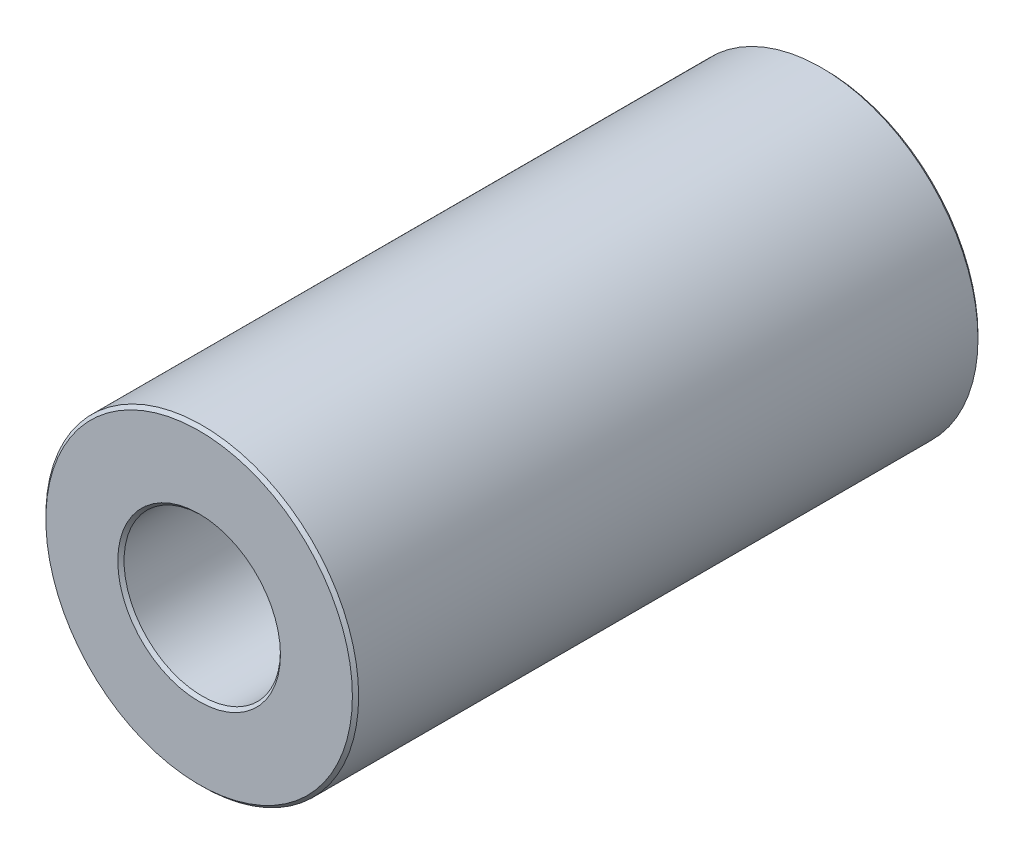
ISO-10303-21;
HEADER;
FILE_DESCRIPTION(('STEP AP214'),'2;1');
FILE_NAME('part.step','',(''),(''),'','','');
FILE_SCHEMA(('AUTOMOTIVE_DESIGN { 1 0 10303 214 1 1 1 1 }'));
ENDSEC;
DATA;
#1=APPLICATION_CONTEXT('core data for automotive mechanical design processes');
#2=APPLICATION_PROTOCOL_DEFINITION('international standard','automotive_design',2000,#1);
#3=PRODUCT_CONTEXT('',#1,'mechanical');
#4=PRODUCT('Part','Part','',(#3));
#5=PRODUCT_RELATED_PRODUCT_CATEGORY('part','',(#4));
#6=PRODUCT_DEFINITION_FORMATION('','',#4);
#7=PRODUCT_DEFINITION_CONTEXT('part definition',#1,'design');
#8=PRODUCT_DEFINITION('design','',#6,#7);
#9=PRODUCT_DEFINITION_SHAPE('','',#8);
#10=(LENGTH_UNIT() NAMED_UNIT(*) SI_UNIT(.MILLI.,.METRE.));
#11=(NAMED_UNIT(*) PLANE_ANGLE_UNIT() SI_UNIT($,.RADIAN.));
#12=(NAMED_UNIT(*) SI_UNIT($,.STERADIAN.) SOLID_ANGLE_UNIT());
#13=UNCERTAINTY_MEASURE_WITH_UNIT(LENGTH_MEASURE(1.E-05),#10,'distance_accuracy_value','');
#14=(GEOMETRIC_REPRESENTATION_CONTEXT(3) GLOBAL_UNCERTAINTY_ASSIGNED_CONTEXT((#13)) GLOBAL_UNIT_ASSIGNED_CONTEXT((#10,
#11,#12)) REPRESENTATION_CONTEXT('',''));
#15=CARTESIAN_POINT('',(0.,0.,0.));
#16=DIRECTION('',(0.,0.,1.));
#17=DIRECTION('',(1.,0.,0.));
#18=AXIS2_PLACEMENT_3D('',#15,#16,#17);
#19=CARTESIAN_POINT('',(0.,0.,25.4));
#20=DIRECTION('',(0.,0.,1.));
#21=DIRECTION('',(1.,0.,0.));
#22=AXIS2_PLACEMENT_3D('',#19,#20,#21);
#23=PLANE('',#22);
#24=CARTESIAN_POINT('',(0.,0.,25.4));
#25=DIRECTION('',(0.,0.,1.));
#26=DIRECTION('',(1.,0.,0.));
#27=AXIS2_PLACEMENT_3D('',#24,#25,#26);
#28=CIRCLE('',#27,12.446);
#29=CARTESIAN_POINT('',(12.446,0.,25.4));
#30=VERTEX_POINT('',#29);
#31=EDGE_CURVE('E65',#30,#30,#28,.T.);
#32=ORIENTED_EDGE('',*,*,#31,.T.);
#33=EDGE_LOOP('',(#32));
#34=FACE_BOUND('',#33,.T.);
#35=CARTESIAN_POINT('',(0.,0.,25.4));
#36=DIRECTION('',(0.,0.,1.));
#37=DIRECTION('',(1.,0.,0.));
#38=AXIS2_PLACEMENT_3D('',#35,#36,#37);
#39=CIRCLE('',#38,6.60399999999999);
#40=CARTESIAN_POINT('',(6.60399999999999,0.,25.4));
#41=VERTEX_POINT('',#40);
#42=EDGE_CURVE('E70',#41,#41,#39,.F.);
#43=ORIENTED_EDGE('',*,*,#42,.T.);
#44=EDGE_LOOP('',(#43));
#45=FACE_BOUND('',#44,.T.);
#46=ADVANCED_FACE('F51',(#34,#45),#23,.T.);
#47=CARTESIAN_POINT('',(0.,0.,-25.4));
#48=DIRECTION('',(0.,0.,1.));
#49=DIRECTION('',(1.,0.,0.));
#50=AXIS2_PLACEMENT_3D('',#47,#48,#49);
#51=PLANE('',#50);
#52=CARTESIAN_POINT('',(0.,0.,-25.4));
#53=DIRECTION('',(0.,0.,1.));
#54=DIRECTION('',(1.,0.,0.));
#55=AXIS2_PLACEMENT_3D('',#52,#53,#54);
#56=CIRCLE('',#55,12.446);
#57=CARTESIAN_POINT('',(12.446,0.,-25.4));
#58=VERTEX_POINT('',#57);
#59=EDGE_CURVE('E76',#58,#58,#56,.F.);
#60=ORIENTED_EDGE('',*,*,#59,.T.);
#61=EDGE_LOOP('',(#60));
#62=FACE_BOUND('',#61,.T.);
#63=CARTESIAN_POINT('',(0.,0.,-25.4));
#64=DIRECTION('',(0.,0.,1.));
#65=DIRECTION('',(1.,0.,0.));
#66=AXIS2_PLACEMENT_3D('',#63,#64,#65);
#67=CIRCLE('',#66,6.60400000000001);
#68=CARTESIAN_POINT('',(6.60400000000001,0.,-25.4));
#69=VERTEX_POINT('',#68);
#70=EDGE_CURVE('E80',#69,#69,#67,.T.);
#71=ORIENTED_EDGE('',*,*,#70,.T.);
#72=EDGE_LOOP('',(#71));
#73=FACE_BOUND('',#72,.T.);
#74=ADVANCED_FACE('F105',(#62,#73),#51,.F.);
#75=CARTESIAN_POINT('',(0.,0.,25.4));
#76=DIRECTION('',(0.,0.,-1.));
#77=DIRECTION('',(-1.,0.,0.));
#78=AXIS2_PLACEMENT_3D('',#75,#76,#77);
#79=CYLINDRICAL_SURFACE('',#78,12.7);
#80=CARTESIAN_POINT('',(0.,0.,-25.146));
#81=DIRECTION('',(0.,0.,1.));
#82=DIRECTION('',(1.,0.,0.));
#83=AXIS2_PLACEMENT_3D('',#80,#81,#82);
#84=CIRCLE('',#83,12.7);
#85=CARTESIAN_POINT('',(12.7,0.,-25.146));
#86=VERTEX_POINT('',#85);
#87=EDGE_CURVE('E84',#86,#86,#84,.T.);
#88=ORIENTED_EDGE('',*,*,#87,.T.);
#89=EDGE_LOOP('',(#88));
#90=FACE_BOUND('',#89,.T.);
#91=CARTESIAN_POINT('',(0.,0.,25.146));
#92=DIRECTION('',(0.,0.,1.));
#93=DIRECTION('',(1.,0.,0.));
#94=AXIS2_PLACEMENT_3D('',#91,#92,#93);
#95=CIRCLE('',#94,12.7);
#96=CARTESIAN_POINT('',(12.7,0.,25.146));
#97=VERTEX_POINT('',#96);
#98=EDGE_CURVE('E88',#97,#97,#95,.F.);
#99=ORIENTED_EDGE('',*,*,#98,.T.);
#100=EDGE_LOOP('',(#99));
#101=FACE_BOUND('',#100,.T.);
#102=ADVANCED_FACE('F93',(#90,#101),#79,.T.);
#103=CARTESIAN_POINT('',(0.,0.,25.4));
#104=DIRECTION('',(0.,0.,-1.));
#105=DIRECTION('',(-1.,0.,0.));
#106=AXIS2_PLACEMENT_3D('',#103,#104,#105);
#107=CYLINDRICAL_SURFACE('',#106,6.35);
#108=CARTESIAN_POINT('',(0.,0.,-25.146));
#109=DIRECTION('',(0.,0.,1.));
#110=DIRECTION('',(1.,0.,0.));
#111=AXIS2_PLACEMENT_3D('',#108,#109,#110);
#112=CIRCLE('',#111,6.35);
#113=CARTESIAN_POINT('',(6.35,0.,-25.146));
#114=VERTEX_POINT('',#113);
#115=EDGE_CURVE('E11',#114,#114,#112,.F.);
#116=ORIENTED_EDGE('',*,*,#115,.T.);
#117=EDGE_LOOP('',(#116));
#118=FACE_BOUND('',#117,.T.);
#119=CARTESIAN_POINT('',(0.,0.,25.146));
#120=DIRECTION('',(0.,0.,1.));
#121=DIRECTION('',(1.,0.,0.));
#122=AXIS2_PLACEMENT_3D('',#119,#120,#121);
#123=CIRCLE('',#122,6.35);
#124=CARTESIAN_POINT('',(6.35,0.,25.146));
#125=VERTEX_POINT('',#124);
#126=EDGE_CURVE('E60',#125,#125,#123,.T.);
#127=ORIENTED_EDGE('',*,*,#126,.T.);
#128=EDGE_LOOP('',(#127));
#129=FACE_BOUND('',#128,.T.);
#130=ADVANCED_FACE('F130',(#118,#129),#107,.F.);
#131=CARTESIAN_POINT('',(0.,0.,-25.146));
#132=DIRECTION('',(0.,0.,1.));
#133=DIRECTION('',(1.,0.,0.));
#134=AXIS2_PLACEMENT_3D('',#131,#132,#133);
#135=CONICAL_SURFACE('',#134,12.7,0.785398163397442);
#136=ORIENTED_EDGE('',*,*,#59,.F.);
#137=EDGE_LOOP('',(#136));
#138=FACE_BOUND('',#137,.T.);
#139=ORIENTED_EDGE('',*,*,#87,.F.);
#140=EDGE_LOOP('',(#139));
#141=FACE_BOUND('',#140,.T.);
#142=ADVANCED_FACE('F99',(#138,#141),#135,.T.);
#143=CARTESIAN_POINT('',(0.,0.,25.4));
#144=DIRECTION('',(0.,0.,-1.));
#145=DIRECTION('',(-1.,0.,0.));
#146=AXIS2_PLACEMENT_3D('',#143,#144,#145);
#147=CONICAL_SURFACE('',#146,12.446,0.785398163397431);
#148=ORIENTED_EDGE('',*,*,#98,.F.);
#149=EDGE_LOOP('',(#148));
#150=FACE_BOUND('',#149,.T.);
#151=ORIENTED_EDGE('',*,*,#31,.F.);
#152=EDGE_LOOP('',(#151));
#153=FACE_BOUND('',#152,.T.);
#154=ADVANCED_FACE('F95',(#150,#153),#147,.T.);
#155=CARTESIAN_POINT('',(0.,0.,-25.4));
#156=DIRECTION('',(0.,0.,-1.));
#157=DIRECTION('',(-1.,0.,0.));
#158=AXIS2_PLACEMENT_3D('',#155,#156,#157);
#159=CONICAL_SURFACE('',#158,6.60400000000001,0.785398163397452);
#160=ORIENTED_EDGE('',*,*,#115,.F.);
#161=EDGE_LOOP('',(#160));
#162=FACE_BOUND('',#161,.T.);
#163=ORIENTED_EDGE('',*,*,#70,.F.);
#164=EDGE_LOOP('',(#163));
#165=FACE_BOUND('',#164,.T.);
#166=ADVANCED_FACE('F98',(#162,#165),#159,.F.);
#167=CARTESIAN_POINT('',(0.,0.,25.146));
#168=DIRECTION('',(0.,0.,1.));
#169=DIRECTION('',(1.,0.,0.));
#170=AXIS2_PLACEMENT_3D('',#167,#168,#169);
#171=CONICAL_SURFACE('',#170,6.35,0.785398163397452);
#172=ORIENTED_EDGE('',*,*,#42,.F.);
#173=EDGE_LOOP('',(#172));
#174=FACE_BOUND('',#173,.T.);
#175=ORIENTED_EDGE('',*,*,#126,.F.);
#176=EDGE_LOOP('',(#175));
#177=FACE_BOUND('',#176,.T.);
#178=ADVANCED_FACE('F54',(#174,#177),#171,.F.);
#179=CLOSED_SHELL('',(#46,#74,#102,#130,#142,#154,#166,#178));
#180=MANIFOLD_SOLID_BREP('B2',#179);
#181=ADVANCED_BREP_SHAPE_REPRESENTATION('',(#18,#180),#14);
#182=SHAPE_DEFINITION_REPRESENTATION(#9,#181);
ENDSEC;
END-ISO-10303-21;
